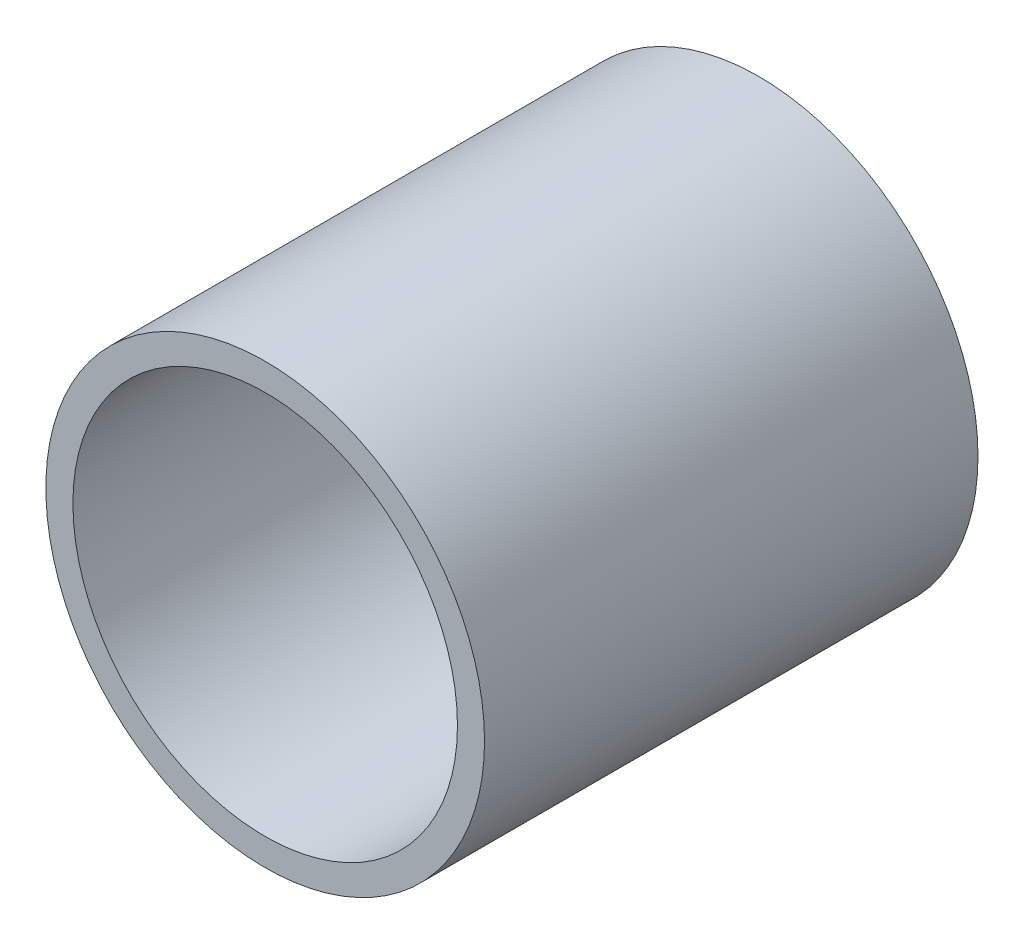
ISO-10303-21;
HEADER;
FILE_DESCRIPTION(('STEP AP214'),'2;1');
FILE_NAME('part.step','',(''),(''),'','','');
FILE_SCHEMA(('AUTOMOTIVE_DESIGN { 1 0 10303 214 1 1 1 1 }'));
ENDSEC;
DATA;
#1=APPLICATION_CONTEXT('core data for automotive mechanical design processes');
#2=APPLICATION_PROTOCOL_DEFINITION('international standard','automotive_design',2000,#1);
#3=PRODUCT_CONTEXT('',#1,'mechanical');
#4=PRODUCT('Part','Part','',(#3));
#5=PRODUCT_RELATED_PRODUCT_CATEGORY('part','',(#4));
#6=PRODUCT_DEFINITION_FORMATION('','',#4);
#7=PRODUCT_DEFINITION_CONTEXT('part definition',#1,'design');
#8=PRODUCT_DEFINITION('design','',#6,#7);
#9=PRODUCT_DEFINITION_SHAPE('','',#8);
#10=(LENGTH_UNIT() NAMED_UNIT(*) SI_UNIT(.MILLI.,.METRE.));
#11=(NAMED_UNIT(*) PLANE_ANGLE_UNIT() SI_UNIT($,.RADIAN.));
#12=(NAMED_UNIT(*) SI_UNIT($,.STERADIAN.) SOLID_ANGLE_UNIT());
#13=UNCERTAINTY_MEASURE_WITH_UNIT(LENGTH_MEASURE(1.E-05),#10,'distance_accuracy_value','');
#14=(GEOMETRIC_REPRESENTATION_CONTEXT(3) GLOBAL_UNCERTAINTY_ASSIGNED_CONTEXT((#13)) GLOBAL_UNIT_ASSIGNED_CONTEXT((#10,
#11,#12)) REPRESENTATION_CONTEXT('',''));
#15=CARTESIAN_POINT('',(0.,0.,0.));
#16=DIRECTION('',(0.,0.,1.));
#17=DIRECTION('',(1.,0.,0.));
#18=AXIS2_PLACEMENT_3D('',#15,#16,#17);
#19=CARTESIAN_POINT('',(0.,0.,50.));
#20=DIRECTION('',(0.,0.,1.));
#21=DIRECTION('',(1.,0.,0.));
#22=AXIS2_PLACEMENT_3D('',#19,#20,#21);
#23=PLANE('',#22);
#24=CARTESIAN_POINT('',(0.,0.,50.));
#25=DIRECTION('',(0.,0.,1.));
#26=DIRECTION('',(1.,0.,0.));
#27=AXIS2_PLACEMENT_3D('',#24,#25,#26);
#28=CIRCLE('',#27,44.45);
#29=CARTESIAN_POINT('',(44.45,0.,50.));
#30=VERTEX_POINT('',#29);
#31=EDGE_CURVE('E11',#30,#30,#28,.T.);
#32=ORIENTED_EDGE('',*,*,#31,.T.);
#33=EDGE_LOOP('',(#32));
#34=FACE_BOUND('',#33,.T.);
#35=CARTESIAN_POINT('',(0.,0.,50.));
#36=DIRECTION('',(0.,0.,1.));
#37=DIRECTION('',(1.,0.,0.));
#38=AXIS2_PLACEMENT_3D('',#35,#36,#37);
#39=CIRCLE('',#38,38.9636);
#40=CARTESIAN_POINT('',(38.9636,0.,50.));
#41=VERTEX_POINT('',#40);
#42=EDGE_CURVE('E56',#41,#41,#39,.T.);
#43=ORIENTED_EDGE('',*,*,#42,.F.);
#44=EDGE_LOOP('',(#43));
#45=FACE_BOUND('',#44,.T.);
#46=ADVANCED_FACE('F43',(#34,#45),#23,.T.);
#47=CARTESIAN_POINT('',(0.,0.,-50.));
#48=DIRECTION('',(0.,0.,1.));
#49=DIRECTION('',(1.,0.,0.));
#50=AXIS2_PLACEMENT_3D('',#47,#48,#49);
#51=PLANE('',#50);
#52=CARTESIAN_POINT('',(0.,0.,-50.));
#53=DIRECTION('',(0.,0.,1.));
#54=DIRECTION('',(1.,0.,0.));
#55=AXIS2_PLACEMENT_3D('',#52,#53,#54);
#56=CIRCLE('',#55,44.45);
#57=CARTESIAN_POINT('',(44.45,0.,-50.));
#58=VERTEX_POINT('',#57);
#59=EDGE_CURVE('E47',#58,#58,#56,.T.);
#60=ORIENTED_EDGE('',*,*,#59,.F.);
#61=EDGE_LOOP('',(#60));
#62=FACE_BOUND('',#61,.T.);
#63=CARTESIAN_POINT('',(0.,0.,-50.));
#64=DIRECTION('',(0.,0.,1.));
#65=DIRECTION('',(1.,0.,0.));
#66=AXIS2_PLACEMENT_3D('',#63,#64,#65);
#67=CIRCLE('',#66,38.9636);
#68=CARTESIAN_POINT('',(38.9636,0.,-50.));
#69=VERTEX_POINT('',#68);
#70=EDGE_CURVE('E58',#69,#69,#67,.T.);
#71=ORIENTED_EDGE('',*,*,#70,.T.);
#72=EDGE_LOOP('',(#71));
#73=FACE_BOUND('',#72,.T.);
#74=ADVANCED_FACE('F70',(#62,#73),#51,.F.);
#75=CARTESIAN_POINT('',(0.,0.,50.));
#76=DIRECTION('',(0.,0.,-1.));
#77=DIRECTION('',(-1.,0.,0.));
#78=AXIS2_PLACEMENT_3D('',#75,#76,#77);
#79=CYLINDRICAL_SURFACE('',#78,44.45);
#80=ORIENTED_EDGE('',*,*,#31,.F.);
#81=EDGE_LOOP('',(#80));
#82=FACE_BOUND('',#81,.T.);
#83=ORIENTED_EDGE('',*,*,#59,.T.);
#84=EDGE_LOOP('',(#83));
#85=FACE_BOUND('',#84,.T.);
#86=ADVANCED_FACE('F45',(#82,#85),#79,.T.);
#87=CARTESIAN_POINT('',(0.,0.,50.));
#88=DIRECTION('',(0.,0.,-1.));
#89=DIRECTION('',(-1.,0.,0.));
#90=AXIS2_PLACEMENT_3D('',#87,#88,#89);
#91=CYLINDRICAL_SURFACE('',#90,38.9636);
#92=ORIENTED_EDGE('',*,*,#42,.T.);
#93=EDGE_LOOP('',(#92));
#94=FACE_BOUND('',#93,.T.);
#95=ORIENTED_EDGE('',*,*,#70,.F.);
#96=EDGE_LOOP('',(#95));
#97=FACE_BOUND('',#96,.T.);
#98=ADVANCED_FACE('F66',(#94,#97),#91,.F.);
#99=CLOSED_SHELL('',(#46,#74,#86,#98));
#100=MANIFOLD_SOLID_BREP('B2',#99);
#101=ADVANCED_BREP_SHAPE_REPRESENTATION('',(#18,#100),#14);
#102=SHAPE_DEFINITION_REPRESENTATION(#9,#101);
ENDSEC;
END-ISO-10303-21;
